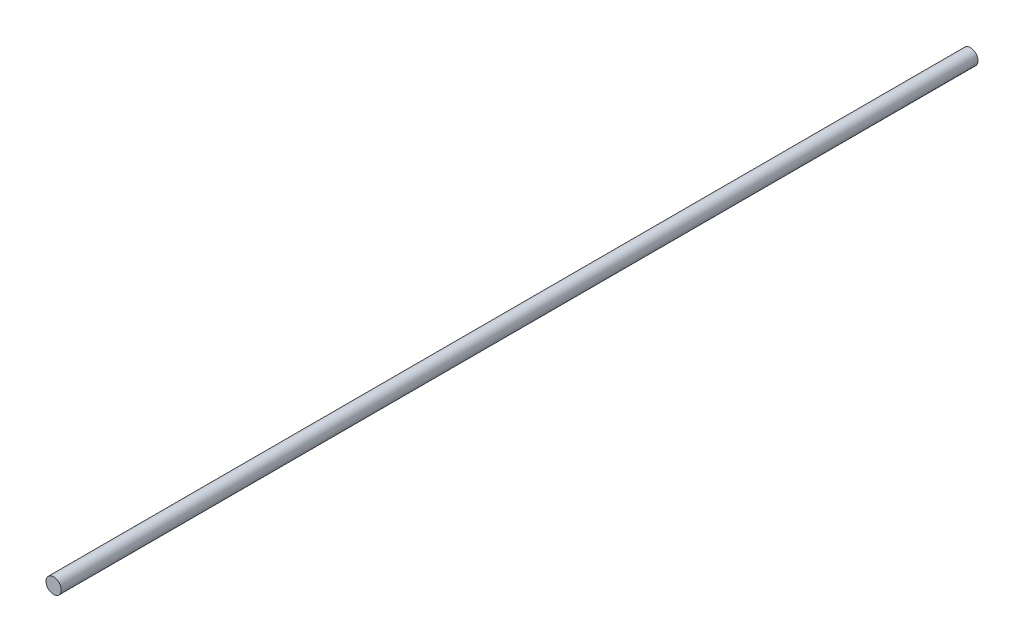
ISO-10303-21;
HEADER;
FILE_DESCRIPTION(('STEP AP214'),'2;1');
FILE_NAME('part.step','',(''),(''),'','','');
FILE_SCHEMA(('AUTOMOTIVE_DESIGN { 1 0 10303 214 1 1 1 1 }'));
ENDSEC;
DATA;
#1=APPLICATION_CONTEXT('core data for automotive mechanical design processes');
#2=APPLICATION_PROTOCOL_DEFINITION('international standard','automotive_design',2000,#1);
#3=PRODUCT_CONTEXT('',#1,'mechanical');
#4=PRODUCT('Part','Part','',(#3));
#5=PRODUCT_RELATED_PRODUCT_CATEGORY('part','',(#4));
#6=PRODUCT_DEFINITION_FORMATION('','',#4);
#7=PRODUCT_DEFINITION_CONTEXT('part definition',#1,'design');
#8=PRODUCT_DEFINITION('design','',#6,#7);
#9=PRODUCT_DEFINITION_SHAPE('','',#8);
#10=(LENGTH_UNIT() NAMED_UNIT(*) SI_UNIT(.MILLI.,.METRE.));
#11=(NAMED_UNIT(*) PLANE_ANGLE_UNIT() SI_UNIT($,.RADIAN.));
#12=(NAMED_UNIT(*) SI_UNIT($,.STERADIAN.) SOLID_ANGLE_UNIT());
#13=UNCERTAINTY_MEASURE_WITH_UNIT(LENGTH_MEASURE(1.E-05),#10,'distance_accuracy_value','');
#14=(GEOMETRIC_REPRESENTATION_CONTEXT(3) GLOBAL_UNCERTAINTY_ASSIGNED_CONTEXT((#13)) GLOBAL_UNIT_ASSIGNED_CONTEXT((#10,
#11,#12)) REPRESENTATION_CONTEXT('',''));
#15=CARTESIAN_POINT('',(0.,0.,0.));
#16=DIRECTION('',(0.,0.,1.));
#17=DIRECTION('',(1.,0.,0.));
#18=AXIS2_PLACEMENT_3D('',#15,#16,#17);
#19=CARTESIAN_POINT('',(0.,0.,120.));
#20=DIRECTION('',(0.,0.,-1.));
#21=DIRECTION('',(-1.,0.,0.));
#22=AXIS2_PLACEMENT_3D('',#19,#20,#21);
#23=CYLINDRICAL_SURFACE('',#22,1.);
#24=CARTESIAN_POINT('',(0.,0.,120.));
#25=DIRECTION('',(0.,0.,1.));
#26=DIRECTION('',(1.,0.,0.));
#27=AXIS2_PLACEMENT_3D('',#24,#25,#26);
#28=CIRCLE('',#27,1.);
#29=CARTESIAN_POINT('',(1.,0.,120.));
#30=VERTEX_POINT('',#29);
#31=EDGE_CURVE('E10',#30,#30,#28,.T.);
#32=ORIENTED_EDGE('',*,*,#31,.F.);
#33=EDGE_LOOP('',(#32));
#34=FACE_BOUND('',#33,.T.);
#35=CARTESIAN_POINT('',(0.,0.,0.));
#36=DIRECTION('',(0.,0.,1.));
#37=DIRECTION('',(1.,0.,0.));
#38=AXIS2_PLACEMENT_3D('',#35,#36,#37);
#39=CIRCLE('',#38,1.);
#40=CARTESIAN_POINT('',(1.,0.,0.));
#41=VERTEX_POINT('',#40);
#42=EDGE_CURVE('E35',#41,#41,#39,.T.);
#43=ORIENTED_EDGE('',*,*,#42,.T.);
#44=EDGE_LOOP('',(#43));
#45=FACE_BOUND('',#44,.T.);
#46=ADVANCED_FACE('F32',(#34,#45),#23,.T.);
#47=CARTESIAN_POINT('',(0.,0.,120.));
#48=DIRECTION('',(0.,0.,1.));
#49=DIRECTION('',(1.,0.,0.));
#50=AXIS2_PLACEMENT_3D('',#47,#48,#49);
#51=PLANE('',#50);
#52=ORIENTED_EDGE('',*,*,#31,.T.);
#53=EDGE_LOOP('',(#52));
#54=FACE_BOUND('',#53,.T.);
#55=ADVANCED_FACE('F47',(#54),#51,.T.);
#56=CARTESIAN_POINT('',(0.,0.,0.));
#57=DIRECTION('',(0.,0.,1.));
#58=DIRECTION('',(1.,0.,0.));
#59=AXIS2_PLACEMENT_3D('',#56,#57,#58);
#60=PLANE('',#59);
#61=ORIENTED_EDGE('',*,*,#42,.F.);
#62=EDGE_LOOP('',(#61));
#63=FACE_BOUND('',#62,.T.);
#64=ADVANCED_FACE('F45',(#63),#60,.F.);
#65=CLOSED_SHELL('',(#46,#55,#64));
#66=MANIFOLD_SOLID_BREP('B2',#65);
#67=ADVANCED_BREP_SHAPE_REPRESENTATION('',(#18,#66),#14);
#68=SHAPE_DEFINITION_REPRESENTATION(#9,#67);
ENDSEC;
END-ISO-10303-21;
